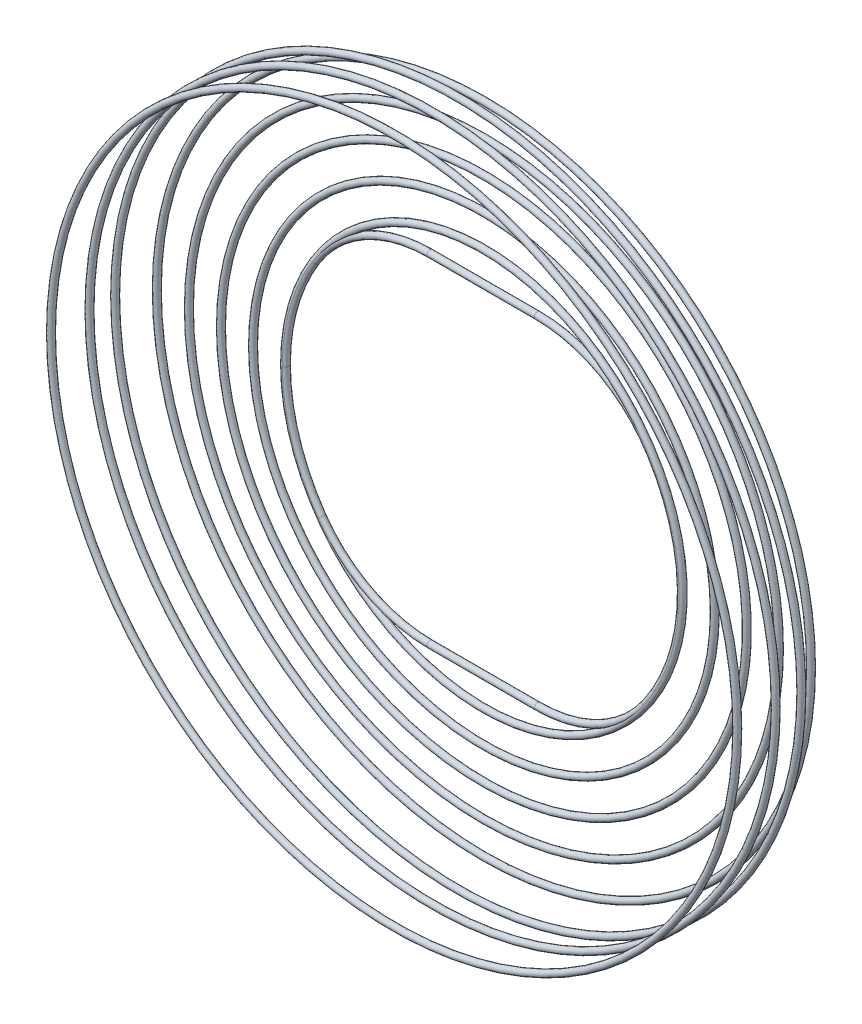
ISO-10303-21;
HEADER;
FILE_DESCRIPTION(('STEP AP214'),'2;1');
FILE_NAME('part.step','',(''),(''),'','','');
FILE_SCHEMA(('AUTOMOTIVE_DESIGN { 1 0 10303 214 1 1 1 1 }'));
ENDSEC;
DATA;
#1=APPLICATION_CONTEXT('core data for automotive mechanical design processes');
#2=APPLICATION_PROTOCOL_DEFINITION('international standard','automotive_design',2000,#1);
#3=PRODUCT_CONTEXT('',#1,'mechanical');
#4=PRODUCT('Part','Part','',(#3));
#5=PRODUCT_RELATED_PRODUCT_CATEGORY('part','',(#4));
#6=PRODUCT_DEFINITION_FORMATION('','',#4);
#7=PRODUCT_DEFINITION_CONTEXT('part definition',#1,'design');
#8=PRODUCT_DEFINITION('design','',#6,#7);
#9=PRODUCT_DEFINITION_SHAPE('','',#8);
#10=(LENGTH_UNIT() NAMED_UNIT(*) SI_UNIT(.MILLI.,.METRE.));
#11=(NAMED_UNIT(*) PLANE_ANGLE_UNIT() SI_UNIT($,.RADIAN.));
#12=(NAMED_UNIT(*) SI_UNIT($,.STERADIAN.) SOLID_ANGLE_UNIT());
#13=UNCERTAINTY_MEASURE_WITH_UNIT(LENGTH_MEASURE(1.E-05),#10,'distance_accuracy_value','');
#14=(GEOMETRIC_REPRESENTATION_CONTEXT(3) GLOBAL_UNCERTAINTY_ASSIGNED_CONTEXT((#13)) GLOBAL_UNIT_ASSIGNED_CONTEXT((#10,
#11,#12)) REPRESENTATION_CONTEXT('',''));
#15=CARTESIAN_POINT('',(0.,0.,0.));
#16=DIRECTION('',(0.,0.,1.));
#17=DIRECTION('',(1.,0.,0.));
#18=AXIS2_PLACEMENT_3D('',#15,#16,#17);
#19=CARTESIAN_POINT('',(0.,0.,0.));
#20=DIRECTION('',(0.,0.,-1.));
#21=DIRECTION('',(-1.,0.,0.));
#22=AXIS2_PLACEMENT_3D('',#19,#20,#21);
#23=TOROIDAL_SURFACE('',#22,61.7581078649831,0.999999999999998);
#24=CARTESIAN_POINT('',(-50.6127601132334,-35.3894391137125,0.));
#25=DIRECTION('',(-0.57303308564896,0.819532234113846,0.));
#26=DIRECTION('',(0.,0.,1.));
#27=AXIS2_PLACEMENT_3D('',#24,#25,#26);
#28=CIRCLE('',#27,0.999999999999998);
#29=CARTESIAN_POINT('',(-51.4322923473473,-35.9624721993615,0.));
#30=VERTEX_POINT('',#29);
#31=EDGE_CURVE('E11',#30,#30,#28,.T.);
#32=CARTESIAN_POINT('',(-61.7581078649831,0.,0.));
#33=DIRECTION('',(0.,1.,0.));
#34=DIRECTION('',(0.,0.,1.));
#35=AXIS2_PLACEMENT_3D('',#32,#33,#34);
#36=CIRCLE('',#35,0.999999999999998);
#37=CARTESIAN_POINT('',(-62.758107864983,0.,0.));
#38=VERTEX_POINT('',#37);
#39=EDGE_CURVE('E70',#38,#38,#36,.T.);
#40=CARTESIAN_POINT('',(0.,0.,0.));
#41=DIRECTION('',(0.,0.,-1.));
#42=DIRECTION('',(-1.,0.,0.));
#43=AXIS2_PLACEMENT_3D('',#40,#41,#42);
#44=CIRCLE('',#43,62.7581078649831);
#45=EDGE_CURVE('',#30,#38,#44,.T.);
#46=ORIENTED_EDGE('',*,*,#31,.T.);
#47=ORIENTED_EDGE('',*,*,#39,.F.);
#48=ORIENTED_EDGE('',*,*,#45,.T.);
#49=ORIENTED_EDGE('',*,*,#45,.F.);
#50=EDGE_LOOP('',(#46,#48,#47,#49));
#51=FACE_BOUND('',#50,.T.);
#52=ADVANCED_FACE('F39',(#51),#23,.T.);
#53=CARTESIAN_POINT('',(-16.7402079764198,-11.705083255823,0.));
#54=DIRECTION('',(0.,0.,-1.));
#55=DIRECTION('',(-1.,0.,0.));
#56=AXIS2_PLACEMENT_3D('',#53,#54,#55);
#57=TOROIDAL_SURFACE('',#56,41.3315678466751,0.999999999999998);
#58=CARTESIAN_POINT('',(-16.7402079764198,-53.0366511024981,0.));
#59=DIRECTION('',(-1.,0.,0.));
#60=DIRECTION('',(0.,0.,1.));
#61=AXIS2_PLACEMENT_3D('',#58,#59,#60);
#62=CIRCLE('',#61,0.999999999999998);
#63=CARTESIAN_POINT('',(-16.7402079764198,-54.0366511024981,0.));
#64=VERTEX_POINT('',#63);
#65=EDGE_CURVE('E45',#64,#64,#62,.T.);
#66=CARTESIAN_POINT('',(-16.7402079764198,-11.705083255823,0.));
#67=DIRECTION('',(0.,0.,-1.));
#68=DIRECTION('',(-1.,0.,0.));
#69=AXIS2_PLACEMENT_3D('',#66,#67,#68);
#70=CIRCLE('',#69,42.3315678466751);
#71=EDGE_CURVE('',#64,#30,#70,.T.);
#72=ORIENTED_EDGE('',*,*,#65,.T.);
#73=ORIENTED_EDGE('',*,*,#31,.F.);
#74=ORIENTED_EDGE('',*,*,#71,.T.);
#75=ORIENTED_EDGE('',*,*,#71,.F.);
#76=EDGE_LOOP('',(#72,#74,#73,#75));
#77=FACE_BOUND('',#76,.T.);
#78=ADVANCED_FACE('F77',(#77),#57,.T.);
#79=CARTESIAN_POINT('',(16.7402079764198,-53.0366511024981,0.));
#80=DIRECTION('',(-1.,0.,0.));
#81=DIRECTION('',(0.,-1.,0.));
#82=AXIS2_PLACEMENT_3D('',#79,#80,#81);
#83=CYLINDRICAL_SURFACE('',#82,0.999999999999998);
#84=ORIENTED_EDGE('',*,*,#65,.F.);
#85=EDGE_LOOP('',(#84));
#86=FACE_BOUND('',#85,.T.);
#87=CARTESIAN_POINT('',(16.7402079764198,-53.0366511024981,0.));
#88=DIRECTION('',(-1.,0.,0.));
#89=DIRECTION('',(0.,0.,1.));
#90=AXIS2_PLACEMENT_3D('',#87,#88,#89);
#91=CIRCLE('',#90,0.999999999999998);
#92=CARTESIAN_POINT('',(16.7402079764198,-54.0366511024981,0.));
#93=VERTEX_POINT('',#92);
#94=EDGE_CURVE('E49',#93,#93,#91,.T.);
#95=ORIENTED_EDGE('',*,*,#94,.T.);
#96=EDGE_LOOP('',(#95));
#97=FACE_BOUND('',#96,.T.);
#98=ADVANCED_FACE('F81',(#86,#97),#83,.T.);
#99=CARTESIAN_POINT('',(16.7402079764198,-11.705083255823,0.));
#100=DIRECTION('',(0.,0.,-1.));
#101=DIRECTION('',(-1.,0.,0.));
#102=AXIS2_PLACEMENT_3D('',#99,#100,#101);
#103=TOROIDAL_SURFACE('',#102,41.3315678466751,0.999999999999998);
#104=CARTESIAN_POINT('',(50.6127601132334,-35.3894391137125,0.));
#105=DIRECTION('',(-0.57303308564896,-0.819532234113846,0.));
#106=DIRECTION('',(0.,0.,1.));
#107=AXIS2_PLACEMENT_3D('',#104,#105,#106);
#108=CIRCLE('',#107,0.999999999999998);
#109=CARTESIAN_POINT('',(51.4322923473473,-35.9624721993615,0.));
#110=VERTEX_POINT('',#109);
#111=EDGE_CURVE('E53',#110,#110,#108,.T.);
#112=CARTESIAN_POINT('',(16.7402079764198,-11.705083255823,0.));
#113=DIRECTION('',(0.,0.,-1.));
#114=DIRECTION('',(-1.,0.,0.));
#115=AXIS2_PLACEMENT_3D('',#112,#113,#114);
#116=CIRCLE('',#115,42.3315678466751);
#117=EDGE_CURVE('',#110,#93,#116,.T.);
#118=ORIENTED_EDGE('',*,*,#111,.T.);
#119=ORIENTED_EDGE('',*,*,#94,.F.);
#120=ORIENTED_EDGE('',*,*,#117,.T.);
#121=ORIENTED_EDGE('',*,*,#117,.F.);
#122=EDGE_LOOP('',(#118,#120,#119,#121));
#123=FACE_BOUND('',#122,.T.);
#124=ADVANCED_FACE('F86',(#123),#103,.T.);
#125=CARTESIAN_POINT('',(0.,0.,0.));
#126=DIRECTION('',(0.,0.,-1.));
#127=DIRECTION('',(-1.,0.,0.));
#128=AXIS2_PLACEMENT_3D('',#125,#126,#127);
#129=TOROIDAL_SURFACE('',#128,61.7581078649831,0.999999999999998);
#130=CARTESIAN_POINT('',(52.338449888367,32.7833883292404,0.));
#131=DIRECTION('',(0.5308353746995,-0.847474958313012,0.));
#132=DIRECTION('',(0.,0.,1.));
#133=AXIS2_PLACEMENT_3D('',#130,#131,#132);
#134=CIRCLE('',#133,0.999999999999998);
#135=CARTESIAN_POINT('',(53.18592484668,33.3142237039399,0.));
#136=VERTEX_POINT('',#135);
#137=EDGE_CURVE('E58',#136,#136,#134,.T.);
#138=CARTESIAN_POINT('',(0.,0.,0.));
#139=DIRECTION('',(0.,0.,-1.));
#140=DIRECTION('',(-1.,0.,0.));
#141=AXIS2_PLACEMENT_3D('',#138,#139,#140);
#142=CIRCLE('',#141,62.7581078649831);
#143=EDGE_CURVE('',#136,#110,#142,.T.);
#144=ORIENTED_EDGE('',*,*,#137,.T.);
#145=ORIENTED_EDGE('',*,*,#111,.F.);
#146=ORIENTED_EDGE('',*,*,#143,.T.);
#147=ORIENTED_EDGE('',*,*,#143,.F.);
#148=EDGE_LOOP('',(#144,#146,#145,#147));
#149=FACE_BOUND('',#148,.T.);
#150=ADVANCED_FACE('F92',(#149),#129,.T.);
#151=CARTESIAN_POINT('',(16.7402079764158,10.4856131577001,0.));
#152=DIRECTION('',(0.,0.,-1.));
#153=DIRECTION('',(-1.,0.,0.));
#154=AXIS2_PLACEMENT_3D('',#151,#152,#153);
#155=TOROIDAL_SURFACE('',#154,42.0050664184972,0.999999999999998);
#156=CARTESIAN_POINT('',(16.7402079764158,52.4906795761973,0.));
#157=DIRECTION('',(1.,0.,0.));
#158=DIRECTION('',(0.,0.,1.));
#159=AXIS2_PLACEMENT_3D('',#156,#157,#158);
#160=CIRCLE('',#159,0.999999999999998);
#161=CARTESIAN_POINT('',(16.7402079764158,53.4906795761973,0.));
#162=VERTEX_POINT('',#161);
#163=EDGE_CURVE('E61',#162,#162,#160,.T.);
#164=CARTESIAN_POINT('',(16.7402079764158,10.4856131577001,0.));
#165=DIRECTION('',(0.,0.,-1.));
#166=DIRECTION('',(-1.,0.,0.));
#167=AXIS2_PLACEMENT_3D('',#164,#165,#166);
#168=CIRCLE('',#167,43.0050664184972);
#169=EDGE_CURVE('',#162,#136,#168,.T.);
#170=ORIENTED_EDGE('',*,*,#163,.T.);
#171=ORIENTED_EDGE('',*,*,#137,.F.);
#172=ORIENTED_EDGE('',*,*,#169,.T.);
#173=ORIENTED_EDGE('',*,*,#169,.F.);
#174=EDGE_LOOP('',(#170,#172,#171,#173));
#175=FACE_BOUND('',#174,.T.);
#176=ADVANCED_FACE('F96',(#175),#155,.T.);
#177=CARTESIAN_POINT('',(-16.7402079764158,52.4906795761973,0.));
#178=DIRECTION('',(1.,0.,0.));
#179=DIRECTION('',(0.,0.,-1.));
#180=AXIS2_PLACEMENT_3D('',#177,#178,#179);
#181=CYLINDRICAL_SURFACE('',#180,0.999999999999998);
#182=ORIENTED_EDGE('',*,*,#163,.F.);
#183=EDGE_LOOP('',(#182));
#184=FACE_BOUND('',#183,.T.);
#185=CARTESIAN_POINT('',(-16.7402079764158,52.4906795761973,0.));
#186=DIRECTION('',(1.,0.,0.));
#187=DIRECTION('',(0.,0.,1.));
#188=AXIS2_PLACEMENT_3D('',#185,#186,#187);
#189=CIRCLE('',#188,0.999999999999998);
#190=CARTESIAN_POINT('',(-16.7402079764158,53.4906795761973,0.));
#191=VERTEX_POINT('',#190);
#192=EDGE_CURVE('E64',#191,#191,#189,.T.);
#193=ORIENTED_EDGE('',*,*,#192,.T.);
#194=EDGE_LOOP('',(#193));
#195=FACE_BOUND('',#194,.T.);
#196=ADVANCED_FACE('F100',(#184,#195),#181,.T.);
#197=CARTESIAN_POINT('',(-16.7402079764158,10.4856131577001,0.));
#198=DIRECTION('',(0.,0.,-1.));
#199=DIRECTION('',(-1.,0.,0.));
#200=AXIS2_PLACEMENT_3D('',#197,#198,#199);
#201=TOROIDAL_SURFACE('',#200,42.0050664184972,0.999999999999998);
#202=CARTESIAN_POINT('',(-52.338449888367,32.7833883292404,0.));
#203=DIRECTION('',(0.5308353746995,0.847474958313012,0.));
#204=DIRECTION('',(0.,0.,1.));
#205=AXIS2_PLACEMENT_3D('',#202,#203,#204);
#206=CIRCLE('',#205,0.999999999999998);
#207=CARTESIAN_POINT('',(-53.18592484668,33.3142237039399,0.));
#208=VERTEX_POINT('',#207);
#209=EDGE_CURVE('E67',#208,#208,#206,.T.);
#210=CARTESIAN_POINT('',(-16.7402079764158,10.4856131577001,0.));
#211=DIRECTION('',(0.,0.,-1.));
#212=DIRECTION('',(-1.,0.,0.));
#213=AXIS2_PLACEMENT_3D('',#210,#211,#212);
#214=CIRCLE('',#213,43.0050664184972);
#215=EDGE_CURVE('',#208,#191,#214,.T.);
#216=ORIENTED_EDGE('',*,*,#209,.T.);
#217=ORIENTED_EDGE('',*,*,#192,.F.);
#218=ORIENTED_EDGE('',*,*,#215,.T.);
#219=ORIENTED_EDGE('',*,*,#215,.F.);
#220=EDGE_LOOP('',(#216,#218,#217,#219));
#221=FACE_BOUND('',#220,.T.);
#222=ADVANCED_FACE('F104',(#221),#201,.T.);
#223=CARTESIAN_POINT('',(0.,0.,0.));
#224=DIRECTION('',(0.,0.,-1.));
#225=DIRECTION('',(-1.,0.,0.));
#226=AXIS2_PLACEMENT_3D('',#223,#224,#225);
#227=TOROIDAL_SURFACE('',#226,61.7581078649831,0.999999999999998);
#228=CARTESIAN_POINT('',(0.,0.,0.));
#229=DIRECTION('',(0.,0.,-1.));
#230=DIRECTION('',(-1.,0.,0.));
#231=AXIS2_PLACEMENT_3D('',#228,#229,#230);
#232=CIRCLE('',#231,62.7581078649831);
#233=EDGE_CURVE('',#38,#208,#232,.T.);
#234=ORIENTED_EDGE('',*,*,#39,.T.);
#235=ORIENTED_EDGE('',*,*,#209,.F.);
#236=ORIENTED_EDGE('',*,*,#233,.T.);
#237=ORIENTED_EDGE('',*,*,#233,.F.);
#238=EDGE_LOOP('',(#234,#236,#235,#237));
#239=FACE_BOUND('',#238,.T.);
#240=ADVANCED_FACE('F74',(#239),#227,.T.);
#241=CLOSED_SHELL('',(#52,#78,#98,#124,#150,#176,#196,#222,#240));
#242=MANIFOLD_SOLID_BREP('B2',#241);
#243=CARTESIAN_POINT('',(0.,0.,28.));
#244=DIRECTION('',(0.,0.,-1.));
#245=DIRECTION('',(-1.,0.,0.));
#246=AXIS2_PLACEMENT_3D('',#243,#244,#245);
#247=TOROIDAL_SURFACE('',#246,107.,0.999999999999999);
#248=CARTESIAN_POINT('',(-108.,0.,28.));
#249=VERTEX_POINT('',#248);
#250=VERTEX_LOOP('',#249);
#251=FACE_BOUND('',#250,.T.);
#252=ADVANCED_FACE('F181',(#251),#247,.T.);
#253=CLOSED_SHELL('',(#252));
#254=MANIFOLD_SOLID_BREP('B6',#253);
#255=CARTESIAN_POINT('',(0.,0.,16.));
#256=DIRECTION('',(0.,0.,-1.));
#257=DIRECTION('',(-1.,0.,0.));
#258=AXIS2_PLACEMENT_3D('',#255,#256,#257);
#259=TOROIDAL_SURFACE('',#258,107.,0.999999999999998);
#260=CARTESIAN_POINT('',(-108.,0.,16.));
#261=VERTEX_POINT('',#260);
#262=VERTEX_LOOP('',#261);
#263=FACE_BOUND('',#262,.T.);
#264=ADVANCED_FACE('F199',(#263),#259,.T.);
#265=CLOSED_SHELL('',(#264));
#266=MANIFOLD_SOLID_BREP('B35',#265);
#267=CARTESIAN_POINT('',(0.,0.,8.));
#268=DIRECTION('',(0.,0.,-1.));
#269=DIRECTION('',(-1.,0.,0.));
#270=AXIS2_PLACEMENT_3D('',#267,#268,#269);
#271=TOROIDAL_SURFACE('',#270,107.,0.999999999999998);
#272=CARTESIAN_POINT('',(-108.,0.,8.));
#273=VERTEX_POINT('',#272);
#274=VERTEX_LOOP('',#273);
#275=FACE_BOUND('',#274,.T.);
#276=ADVANCED_FACE('F217',(#275),#271,.T.);
#277=CLOSED_SHELL('',(#276));
#278=MANIFOLD_SOLID_BREP('B177',#277);
#279=CARTESIAN_POINT('',(0.,0.,0.));
#280=DIRECTION('',(0.,0.,-1.));
#281=DIRECTION('',(-1.,0.,0.));
#282=AXIS2_PLACEMENT_3D('',#279,#280,#281);
#283=TOROIDAL_SURFACE('',#282,102.,0.999999999999998);
#284=CARTESIAN_POINT('',(-103.,0.,0.));
#285=VERTEX_POINT('',#284);
#286=VERTEX_LOOP('',#285);
#287=FACE_BOUND('',#286,.T.);
#288=ADVANCED_FACE('F235',(#287),#283,.T.);
#289=CLOSED_SHELL('',(#288));
#290=MANIFOLD_SOLID_BREP('B195',#289);
#291=CARTESIAN_POINT('',(0.,0.,0.));
#292=DIRECTION('',(0.,0.,-1.));
#293=DIRECTION('',(-1.,0.,0.));
#294=AXIS2_PLACEMENT_3D('',#291,#292,#293);
#295=TOROIDAL_SURFACE('',#294,92.,0.999999999999998);
#296=CARTESIAN_POINT('',(-93.,0.,0.));
#297=VERTEX_POINT('',#296);
#298=VERTEX_LOOP('',#297);
#299=FACE_BOUND('',#298,.T.);
#300=ADVANCED_FACE('F253',(#299),#295,.T.);
#301=CLOSED_SHELL('',(#300));
#302=MANIFOLD_SOLID_BREP('B213',#301);
#303=CARTESIAN_POINT('',(0.,0.,0.));
#304=DIRECTION('',(0.,0.,-1.));
#305=DIRECTION('',(-1.,0.,0.));
#306=AXIS2_PLACEMENT_3D('',#303,#304,#305);
#307=TOROIDAL_SURFACE('',#306,81.9999999999999,0.999999999999998);
#308=CARTESIAN_POINT('',(-82.9999999999999,0.,0.));
#309=VERTEX_POINT('',#308);
#310=VERTEX_LOOP('',#309);
#311=FACE_BOUND('',#310,.T.);
#312=ADVANCED_FACE('F271',(#311),#307,.T.);
#313=CLOSED_SHELL('',(#312));
#314=MANIFOLD_SOLID_BREP('B231',#313);
#315=CARTESIAN_POINT('',(0.,0.,0.));
#316=DIRECTION('',(0.,0.,-1.));
#317=DIRECTION('',(-1.,0.,0.));
#318=AXIS2_PLACEMENT_3D('',#315,#316,#317);
#319=TOROIDAL_SURFACE('',#318,72.,0.999999999999998);
#320=CARTESIAN_POINT('',(-73.,0.,0.));
#321=VERTEX_POINT('',#320);
#322=VERTEX_LOOP('',#321);
#323=FACE_BOUND('',#322,.T.);
#324=ADVANCED_FACE('F288',(#323),#319,.T.);
#325=CLOSED_SHELL('',(#324));
#326=MANIFOLD_SOLID_BREP('B249',#325);
#327=CARTESIAN_POINT('',(0.,0.,0.));
#328=DIRECTION('',(0.,0.,-1.));
#329=DIRECTION('',(-1.,0.,0.));
#330=AXIS2_PLACEMENT_3D('',#327,#328,#329);
#331=TOROIDAL_SURFACE('',#330,62.,0.999999999999998);
#332=CARTESIAN_POINT('',(-63.,0.,0.));
#333=VERTEX_POINT('',#332);
#334=VERTEX_LOOP('',#333);
#335=FACE_BOUND('',#334,.T.);
#336=ADVANCED_FACE('F300',(#335),#331,.T.);
#337=CLOSED_SHELL('',(#336));
#338=MANIFOLD_SOLID_BREP('B267',#337);
#339=ADVANCED_BREP_SHAPE_REPRESENTATION('',(#18,#242,#254,#266,#278,#290,#302,#314,#326,#338),#14);
#340=SHAPE_DEFINITION_REPRESENTATION(#9,#339);
ENDSEC;
END-ISO-10303-21;
